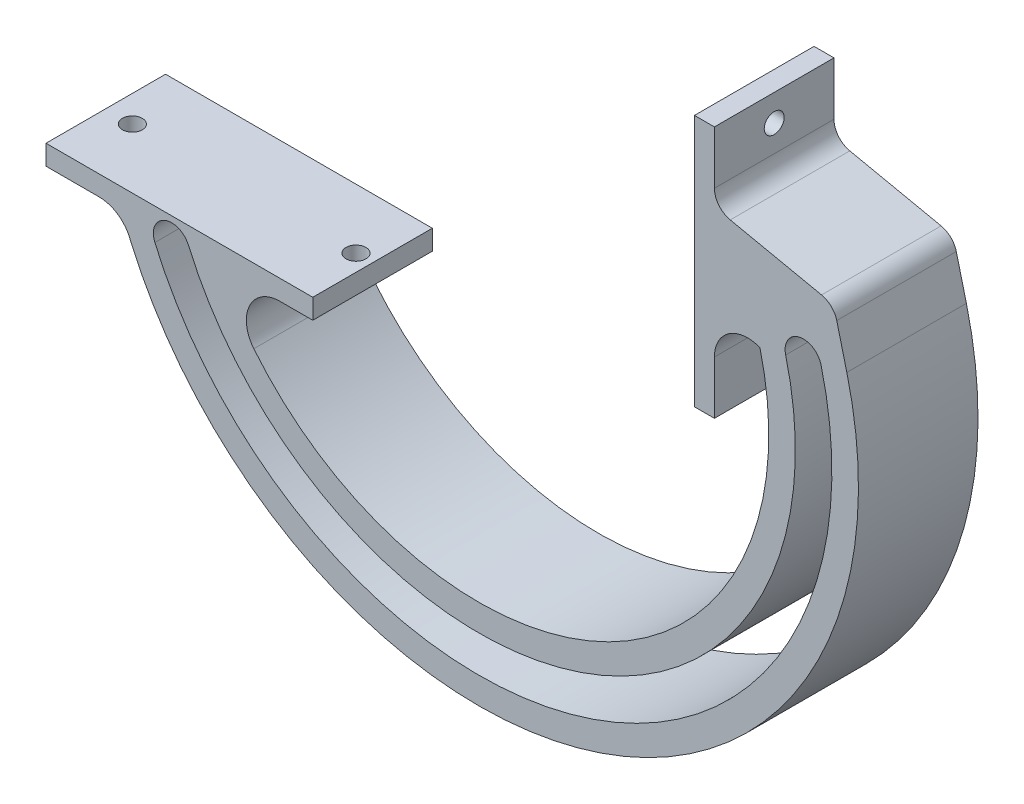
ISO-10303-21;
HEADER;
FILE_DESCRIPTION(('STEP AP214'),'2;1');
FILE_NAME('part.step','',(''),(''),'','','');
FILE_SCHEMA(('AUTOMOTIVE_DESIGN { 1 0 10303 214 1 1 1 1 }'));
ENDSEC;
DATA;
#1=APPLICATION_CONTEXT('core data for automotive mechanical design processes');
#2=APPLICATION_PROTOCOL_DEFINITION('international standard','automotive_design',2000,#1);
#3=PRODUCT_CONTEXT('',#1,'mechanical');
#4=PRODUCT('Part','Part','',(#3));
#5=PRODUCT_RELATED_PRODUCT_CATEGORY('part','',(#4));
#6=PRODUCT_DEFINITION_FORMATION('','',#4);
#7=PRODUCT_DEFINITION_CONTEXT('part definition',#1,'design');
#8=PRODUCT_DEFINITION('design','',#6,#7);
#9=PRODUCT_DEFINITION_SHAPE('','',#8);
#10=(LENGTH_UNIT() NAMED_UNIT(*) SI_UNIT(.MILLI.,.METRE.));
#11=(NAMED_UNIT(*) PLANE_ANGLE_UNIT() SI_UNIT($,.RADIAN.));
#12=(NAMED_UNIT(*) SI_UNIT($,.STERADIAN.) SOLID_ANGLE_UNIT());
#13=UNCERTAINTY_MEASURE_WITH_UNIT(LENGTH_MEASURE(1.E-05),#10,'distance_accuracy_value','');
#14=(GEOMETRIC_REPRESENTATION_CONTEXT(3) GLOBAL_UNCERTAINTY_ASSIGNED_CONTEXT((#13)) GLOBAL_UNIT_ASSIGNED_CONTEXT((#10,
#11,#12)) REPRESENTATION_CONTEXT('',''));
#15=CARTESIAN_POINT('',(0.,0.,0.));
#16=DIRECTION('',(0.,0.,1.));
#17=DIRECTION('',(1.,0.,0.));
#18=AXIS2_PLACEMENT_3D('',#15,#16,#17);
#19=CARTESIAN_POINT('',(21.8963046697023,0.,-9.));
#20=DIRECTION('',(-1.,0.,0.));
#21=DIRECTION('',(0.,-1.,0.));
#22=AXIS2_PLACEMENT_3D('',#19,#20,#21);
#23=PLANE('',#22);
#24=CARTESIAN_POINT('',(21.8963046697023,55.3880299889985,0.));
#25=DIRECTION('',(-1.,0.,0.));
#26=DIRECTION('',(0.,-1.,0.));
#27=AXIS2_PLACEMENT_3D('',#24,#25,#26);
#28=CIRCLE('',#27,1.5);
#29=CARTESIAN_POINT('',(21.8963046697023,56.8880299889985,0.));
#30=VERTEX_POINT('',#29);
#31=EDGE_CURVE('E249',#30,#30,#28,.T.);
#32=ORIENTED_EDGE('',*,*,#31,.T.);
#33=EDGE_LOOP('',(#32));
#34=FACE_BOUND('',#33,.T.);
#35=DIRECTION('',(0.,0.,-1.));
#36=VECTOR('',#35,1.);
#37=CARTESIAN_POINT('',(21.8963046697023,51.3880299889985,9.));
#38=LINE('',#37,#36);
#39=CARTESIAN_POINT('',(21.8963046697023,51.3880299889985,9.));
#40=VERTEX_POINT('',#39);
#41=CARTESIAN_POINT('',(21.8963046697023,51.3880299889985,-9.));
#42=VERTEX_POINT('',#41);
#43=EDGE_CURVE('E273',#40,#42,#38,.T.);
#44=ORIENTED_EDGE('',*,*,#43,.T.);
#45=DIRECTION('',(0.,-1.,0.));
#46=VECTOR('',#45,1.);
#47=CARTESIAN_POINT('',(21.8963046697023,0.,-9.));
#48=LINE('',#47,#46);
#49=CARTESIAN_POINT('',(21.8963046697023,59.3880299889985,-9.));
#50=VERTEX_POINT('',#49);
#51=EDGE_CURVE('E277',#50,#42,#48,.T.);
#52=ORIENTED_EDGE('',*,*,#51,.F.);
#53=DIRECTION('',(0.,0.,-1.));
#54=VECTOR('',#53,1.);
#55=CARTESIAN_POINT('',(21.8963046697023,59.3880299889985,9.));
#56=LINE('',#55,#54);
#57=CARTESIAN_POINT('',(21.8963046697023,59.3880299889985,9.));
#58=VERTEX_POINT('',#57);
#59=EDGE_CURVE('E231',#58,#50,#56,.T.);
#60=ORIENTED_EDGE('',*,*,#59,.F.);
#61=DIRECTION('',(0.,-1.,0.));
#62=VECTOR('',#61,1.);
#63=CARTESIAN_POINT('',(21.8963046697023,0.,9.));
#64=LINE('',#63,#62);
#65=EDGE_CURVE('E222',#58,#40,#64,.T.);
#66=ORIENTED_EDGE('',*,*,#65,.T.);
#67=EDGE_LOOP('',(#44,#52,#60,#66));
#68=FACE_BOUND('',#67,.T.);
#69=ADVANCED_FACE('F45',(#34,#68),#23,.F.);
#70=CARTESIAN_POINT('',(-59.8183992300001,3.28891664000023,9.));
#71=DIRECTION('',(0.,0.,-1.));
#72=DIRECTION('',(-1.,0.,0.));
#73=AXIS2_PLACEMENT_3D('',#70,#71,#72);
#74=CYLINDRICAL_SURFACE('',#73,6.75);
#75=DIRECTION('',(0.,0.,-1.));
#76=VECTOR('',#75,1.);
#77=CARTESIAN_POINT('',(-66.1614947127887,0.980748601007607,9.));
#78=LINE('',#77,#76);
#79=CARTESIAN_POINT('',(-66.1614947127887,0.98074860100761,9.));
#80=VERTEX_POINT('',#79);
#81=CARTESIAN_POINT('',(-66.1614947127887,0.980748601007607,-9.));
#82=VERTEX_POINT('',#81);
#83=EDGE_CURVE('E317',#80,#82,#78,.T.);
#84=ORIENTED_EDGE('',*,*,#83,.T.);
#85=CARTESIAN_POINT('',(-59.8183992300001,3.28891664000023,-9.));
#86=DIRECTION('',(0.,0.,1.));
#87=DIRECTION('',(1.,0.,0.));
#88=AXIS2_PLACEMENT_3D('',#85,#86,#87);
#89=CIRCLE('',#88,6.75);
#90=CARTESIAN_POINT('',(-66.0126184035577,0.606725589770724,-9.));
#91=VERTEX_POINT('',#90);
#92=EDGE_CURVE('E358',#82,#91,#89,.T.);
#93=ORIENTED_EDGE('',*,*,#92,.T.);
#94=DIRECTION('',(0.,0.,-1.));
#95=VECTOR('',#94,1.);
#96=CARTESIAN_POINT('',(-66.0126184035577,0.606725589770724,9.));
#97=LINE('',#96,#95);
#98=CARTESIAN_POINT('',(-66.0126184035577,0.606725589770724,9.));
#99=VERTEX_POINT('',#98);
#100=EDGE_CURVE('E390',#99,#91,#97,.T.);
#101=ORIENTED_EDGE('',*,*,#100,.F.);
#102=CARTESIAN_POINT('',(-59.8183992300001,3.28891664000023,9.));
#103=DIRECTION('',(0.,0.,1.));
#104=DIRECTION('',(1.,0.,0.));
#105=AXIS2_PLACEMENT_3D('',#102,#103,#104);
#106=CIRCLE('',#105,6.75);
#107=EDGE_CURVE('E62',#80,#99,#106,.T.);
#108=ORIENTED_EDGE('',*,*,#107,.F.);
#109=EDGE_LOOP('',(#84,#93,#101,#108));
#110=FACE_BOUND('',#109,.T.);
#111=ADVANCED_FACE('F441',(#110),#74,.T.);
#112=CARTESIAN_POINT('',(-13.5682293422799,23.3159431737053,9.));
#113=DIRECTION('',(0.,0.,-1.));
#114=DIRECTION('',(-1.,0.,0.));
#115=AXIS2_PLACEMENT_3D('',#112,#113,#114);
#116=CYLINDRICAL_SURFACE('',#115,57.1500000637372);
#117=CARTESIAN_POINT('',(-13.5682293422799,23.3159431737053,-9.));
#118=DIRECTION('',(0.,0.,1.));
#119=DIRECTION('',(1.,0.,0.));
#120=AXIS2_PLACEMENT_3D('',#117,#118,#119);
#121=CIRCLE('',#120,57.1500000637372);
#122=CARTESIAN_POINT('',(41.8322994444411,37.3481888042828,-9.));
#123=VERTEX_POINT('',#122);
#124=EDGE_CURVE('E384',#91,#123,#121,.T.);
#125=ORIENTED_EDGE('',*,*,#124,.T.);
#126=DIRECTION('',(0.,0.,-1.));
#127=VECTOR('',#126,1.);
#128=CARTESIAN_POINT('',(41.8322994444411,37.3481888042828,9.));
#129=LINE('',#128,#127);
#130=CARTESIAN_POINT('',(41.8322994444411,37.3481888042828,9.));
#131=VERTEX_POINT('',#130);
#132=EDGE_CURVE('E11',#131,#123,#129,.T.);
#133=ORIENTED_EDGE('',*,*,#132,.F.);
#134=CARTESIAN_POINT('',(-13.5682293422799,23.3159431737053,9.));
#135=DIRECTION('',(0.,0.,1.));
#136=DIRECTION('',(1.,0.,0.));
#137=AXIS2_PLACEMENT_3D('',#134,#135,#136);
#138=CIRCLE('',#137,57.1500000637372);
#139=EDGE_CURVE('E366',#99,#131,#138,.T.);
#140=ORIENTED_EDGE('',*,*,#139,.F.);
#141=ORIENTED_EDGE('',*,*,#100,.T.);
#142=EDGE_LOOP('',(#125,#133,#140,#141));
#143=FACE_BOUND('',#142,.T.);
#144=ADVANCED_FACE('F449',(#143),#116,.T.);
#145=CARTESIAN_POINT('',(-13.5682293422799,23.3159431737053,9.));
#146=DIRECTION('',(0.,0.,-1.));
#147=DIRECTION('',(-1.,0.,0.));
#148=AXIS2_PLACEMENT_3D('',#145,#146,#147);
#149=CYLINDRICAL_SURFACE('',#148,43.6500000637372);
#150=DIRECTION('',(0.,0.,-1.));
#151=VECTOR('',#150,1.);
#152=CARTESIAN_POINT('',(-47.4479859261599,-4.20649493379697,9.));
#153=LINE('',#152,#151);
#154=CARTESIAN_POINT('',(-47.4479859261599,-4.20649493379697,9.));
#155=VERTEX_POINT('',#154);
#156=CARTESIAN_POINT('',(-47.4479859261599,-4.20649493379697,-9.));
#157=VERTEX_POINT('',#156);
#158=EDGE_CURVE('E338',#155,#157,#153,.T.);
#159=ORIENTED_EDGE('',*,*,#158,.F.);
#160=CARTESIAN_POINT('',(-13.5682293422799,23.3159431737053,9.));
#161=DIRECTION('',(0.,0.,1.));
#162=DIRECTION('',(1.,0.,0.));
#163=AXIS2_PLACEMENT_3D('',#160,#161,#162);
#164=CIRCLE('',#163,43.6500000637372);
#165=CARTESIAN_POINT('',(28.7455603755589,34.0334851157172,9.));
#166=VERTEX_POINT('',#165);
#167=EDGE_CURVE('E369',#155,#166,#164,.T.);
#168=ORIENTED_EDGE('',*,*,#167,.T.);
#169=DIRECTION('',(0.,0.,-1.));
#170=VECTOR('',#169,1.);
#171=CARTESIAN_POINT('',(28.7455603755589,34.0334851157172,9.));
#172=LINE('',#171,#170);
#173=CARTESIAN_POINT('',(28.7455603755589,34.0334851157172,-9.));
#174=VERTEX_POINT('',#173);
#175=EDGE_CURVE('E54',#166,#174,#172,.T.);
#176=ORIENTED_EDGE('',*,*,#175,.T.);
#177=CARTESIAN_POINT('',(-13.5682293422799,23.3159431737053,-9.));
#178=DIRECTION('',(0.,0.,1.));
#179=DIRECTION('',(1.,0.,0.));
#180=AXIS2_PLACEMENT_3D('',#177,#178,#179);
#181=CIRCLE('',#180,43.6500000637372);
#182=EDGE_CURVE('E387',#157,#174,#181,.T.);
#183=ORIENTED_EDGE('',*,*,#182,.F.);
#184=EDGE_LOOP('',(#159,#168,#176,#183));
#185=FACE_BOUND('',#184,.T.);
#186=ADVANCED_FACE('F487',(#185),#149,.F.);
#187=CARTESIAN_POINT('',(35.28892991,35.69083696,9.));
#188=DIRECTION('',(0.,0.,-1.));
#189=DIRECTION('',(-1.,0.,0.));
#190=AXIS2_PLACEMENT_3D('',#187,#188,#189);
#191=CYLINDRICAL_SURFACE('',#190,2.75000000000001);
#192=CARTESIAN_POINT('',(35.28892991,35.69083696,-9.));
#193=DIRECTION('',(0.,0.,1.));
#194=DIRECTION('',(1.,0.,0.));
#195=AXIS2_PLACEMENT_3D('',#192,#193,#194);
#196=CIRCLE('',#195,2.75000000000001);
#197=CARTESIAN_POINT('',(37.9547471277353,36.3660543780412,-9.));
#198=VERTEX_POINT('',#197);
#199=CARTESIAN_POINT('',(32.6231126922647,35.0156195419588,-9.));
#200=VERTEX_POINT('',#199);
#201=EDGE_CURVE('E348',#198,#200,#196,.T.);
#202=ORIENTED_EDGE('',*,*,#201,.F.);
#203=DIRECTION('',(0.,0.,-1.));
#204=VECTOR('',#203,1.);
#205=CARTESIAN_POINT('',(37.9547471277353,36.3660543780412,9.));
#206=LINE('',#205,#204);
#207=CARTESIAN_POINT('',(37.9547471277353,36.3660543780412,9.));
#208=VERTEX_POINT('',#207);
#209=EDGE_CURVE('E393',#208,#198,#206,.T.);
#210=ORIENTED_EDGE('',*,*,#209,.F.);
#211=CARTESIAN_POINT('',(35.28892991,35.69083696,9.));
#212=DIRECTION('',(0.,0.,1.));
#213=DIRECTION('',(1.,0.,0.));
#214=AXIS2_PLACEMENT_3D('',#211,#212,#213);
#215=CIRCLE('',#214,2.75000000000001);
#216=CARTESIAN_POINT('',(32.6231126922647,35.0156195419588,9.));
#217=VERTEX_POINT('',#216);
#218=EDGE_CURVE('E354',#208,#217,#215,.T.);
#219=ORIENTED_EDGE('',*,*,#218,.T.);
#220=DIRECTION('',(0.,0.,-1.));
#221=VECTOR('',#220,1.);
#222=CARTESIAN_POINT('',(32.6231126922647,35.0156195419588,9.));
#223=LINE('',#222,#221);
#224=EDGE_CURVE('E372',#217,#200,#223,.T.);
#225=ORIENTED_EDGE('',*,*,#224,.T.);
#226=EDGE_LOOP('',(#202,#210,#219,#225));
#227=FACE_BOUND('',#226,.T.);
#228=ADVANCED_FACE('F47',(#227),#191,.F.);
#229=CARTESIAN_POINT('',(-13.5682293422799,23.3159431737054,9.));
#230=DIRECTION('',(0.,0.,-1.));
#231=DIRECTION('',(-1.,0.,0.));
#232=AXIS2_PLACEMENT_3D('',#229,#230,#231);
#233=CYLINDRICAL_SURFACE('',#232,53.1500000637372);
#234=CARTESIAN_POINT('',(-13.5682293422799,23.3159431737054,-9.));
#235=DIRECTION('',(0.,0.,1.));
#236=DIRECTION('',(1.,0.,0.));
#237=AXIS2_PLACEMENT_3D('',#234,#235,#236);
#238=CIRCLE('',#237,53.1500000637372);
#239=CARTESIAN_POINT('',(-62.3419700044124,2.19617213805475,-9.));
#240=VERTEX_POINT('',#239);
#241=EDGE_CURVE('E375',#240,#198,#238,.T.);
#242=ORIENTED_EDGE('',*,*,#241,.F.);
#243=DIRECTION('',(0.,0.,-1.));
#244=VECTOR('',#243,1.);
#245=CARTESIAN_POINT('',(-62.3419700044124,2.19617213805475,9.));
#246=LINE('',#245,#244);
#247=CARTESIAN_POINT('',(-62.3419700044124,2.19617213805475,9.));
#248=VERTEX_POINT('',#247);
#249=EDGE_CURVE('E398',#248,#240,#246,.T.);
#250=ORIENTED_EDGE('',*,*,#249,.F.);
#251=CARTESIAN_POINT('',(-13.5682293422799,23.3159431737054,9.));
#252=DIRECTION('',(0.,0.,1.));
#253=DIRECTION('',(1.,0.,0.));
#254=AXIS2_PLACEMENT_3D('',#251,#252,#253);
#255=CIRCLE('',#254,53.1500000637372);
#256=EDGE_CURVE('E357',#248,#208,#255,.T.);
#257=ORIENTED_EDGE('',*,*,#256,.T.);
#258=ORIENTED_EDGE('',*,*,#209,.T.);
#259=EDGE_LOOP('',(#242,#250,#257,#258));
#260=FACE_BOUND('',#259,.T.);
#261=ADVANCED_FACE('F499',(#260),#233,.F.);
#262=CARTESIAN_POINT('',(-59.81839923,3.28891664,9.));
#263=DIRECTION('',(0.,0.,-1.));
#264=DIRECTION('',(-1.,0.,0.));
#265=AXIS2_PLACEMENT_3D('',#262,#263,#264);
#266=CYLINDRICAL_SURFACE('',#265,2.75);
#267=CARTESIAN_POINT('',(-59.81839923,3.28891664,-9.));
#268=DIRECTION('',(0.,0.,1.));
#269=DIRECTION('',(1.,0.,0.));
#270=AXIS2_PLACEMENT_3D('',#267,#268,#269);
#271=CIRCLE('',#270,2.75);
#272=CARTESIAN_POINT('',(-57.2948284555876,4.38166114194528,-9.));
#273=VERTEX_POINT('',#272);
#274=EDGE_CURVE('E378',#273,#240,#271,.T.);
#275=ORIENTED_EDGE('',*,*,#274,.F.);
#276=DIRECTION('',(0.,0.,-1.));
#277=VECTOR('',#276,1.);
#278=CARTESIAN_POINT('',(-57.2948284555876,4.38166114194528,9.));
#279=LINE('',#278,#277);
#280=CARTESIAN_POINT('',(-57.2948284555876,4.38166114194528,9.));
#281=VERTEX_POINT('',#280);
#282=EDGE_CURVE('E396',#281,#273,#279,.T.);
#283=ORIENTED_EDGE('',*,*,#282,.F.);
#284=CARTESIAN_POINT('',(-59.81839923,3.28891664,9.));
#285=DIRECTION('',(0.,0.,1.));
#286=DIRECTION('',(1.,0.,0.));
#287=AXIS2_PLACEMENT_3D('',#284,#285,#286);
#288=CIRCLE('',#287,2.75);
#289=EDGE_CURVE('E361',#281,#248,#288,.T.);
#290=ORIENTED_EDGE('',*,*,#289,.T.);
#291=ORIENTED_EDGE('',*,*,#249,.T.);
#292=EDGE_LOOP('',(#275,#283,#290,#291));
#293=FACE_BOUND('',#292,.T.);
#294=ADVANCED_FACE('F496',(#293),#266,.F.);
#295=CARTESIAN_POINT('',(-13.5682293422799,23.3159431737054,9.));
#296=DIRECTION('',(0.,0.,-1.));
#297=DIRECTION('',(-1.,0.,0.));
#298=AXIS2_PLACEMENT_3D('',#295,#296,#297);
#299=CYLINDRICAL_SURFACE('',#298,47.6500000637372);
#300=CARTESIAN_POINT('',(-13.5682293422799,23.3159431737054,-9.));
#301=DIRECTION('',(0.,0.,1.));
#302=DIRECTION('',(1.,0.,0.));
#303=AXIS2_PLACEMENT_3D('',#300,#301,#302);
#304=CIRCLE('',#303,47.6500000637372);
#305=EDGE_CURVE('E381',#273,#200,#304,.T.);
#306=ORIENTED_EDGE('',*,*,#305,.T.);
#307=ORIENTED_EDGE('',*,*,#224,.F.);
#308=CARTESIAN_POINT('',(-13.5682293422799,23.3159431737054,9.));
#309=DIRECTION('',(0.,0.,1.));
#310=DIRECTION('',(1.,0.,0.));
#311=AXIS2_PLACEMENT_3D('',#308,#309,#310);
#312=CIRCLE('',#311,47.6500000637372);
#313=EDGE_CURVE('E364',#281,#217,#312,.T.);
#314=ORIENTED_EDGE('',*,*,#313,.F.);
#315=ORIENTED_EDGE('',*,*,#282,.T.);
#316=EDGE_LOOP('',(#306,#307,#314,#315));
#317=FACE_BOUND('',#316,.T.);
#318=ADVANCED_FACE('F484',(#317),#299,.T.);
#319=CARTESIAN_POINT('',(0.,0.,9.));
#320=DIRECTION('',(0.,0.,1.));
#321=DIRECTION('',(1.,0.,0.));
#322=AXIS2_PLACEMENT_3D('',#319,#320,#321);
#323=PLANE('',#322);
#324=DIRECTION('',(-1.,0.,0.));
#325=VECTOR('',#324,1.);
#326=CARTESIAN_POINT('',(0.,6.94613256532267,9.));
#327=LINE('',#326,#325);
#328=CARTESIAN_POINT('',(-38.5671432532608,6.94613256532267,9.));
#329=VERTEX_POINT('',#328);
#330=CARTESIAN_POINT('',(-78.7288065685013,6.94613256532267,9.));
#331=VERTEX_POINT('',#330);
#332=EDGE_CURVE('E329',#329,#331,#327,.T.);
#333=ORIENTED_EDGE('',*,*,#332,.T.);
#334=DIRECTION('',(0.,-1.,0.));
#335=VECTOR('',#334,1.);
#336=CARTESIAN_POINT('',(-78.7288065685013,0.,9.));
#337=LINE('',#336,#335);
#338=CARTESIAN_POINT('',(-78.7288065685013,3.94613256532267,9.));
#339=VERTEX_POINT('',#338);
#340=EDGE_CURVE('E309',#331,#339,#337,.T.);
#341=ORIENTED_EDGE('',*,*,#340,.T.);
#342=DIRECTION('',(1.,0.,0.));
#343=VECTOR('',#342,1.);
#344=CARTESIAN_POINT('',(0.,3.94613256532265,9.));
#345=LINE('',#344,#343);
#346=CARTESIAN_POINT('',(-70.7288065685014,3.94613256532267,9.));
#347=VERTEX_POINT('',#346);
#348=EDGE_CURVE('E306',#339,#347,#345,.T.);
#349=ORIENTED_EDGE('',*,*,#348,.T.);
#350=CARTESIAN_POINT('',(-70.7288065685014,-1.05386743467733,9.));
#351=DIRECTION('',(0.,0.,-1.));
#352=DIRECTION('',(-1.,0.,0.));
#353=AXIS2_PLACEMENT_3D('',#350,#351,#352);
#354=CIRCLE('',#353,5.);
#355=EDGE_CURVE('E304',#347,#80,#354,.T.);
#356=ORIENTED_EDGE('',*,*,#355,.T.);
#357=ORIENTED_EDGE('',*,*,#107,.T.);
#358=ORIENTED_EDGE('',*,*,#139,.T.);
#359=DIRECTION('',(0.245533606560409,-0.969388079176466,0.));
#360=VECTOR('',#359,1.);
#361=CARTESIAN_POINT('',(41.8322994444411,37.3481888042828,9.));
#362=LINE('',#361,#360);
#363=CARTESIAN_POINT('',(40.3125761561024,43.3481888042828,9.));
#364=VERTEX_POINT('',#363);
#365=EDGE_CURVE('E232',#364,#131,#362,.T.);
#366=ORIENTED_EDGE('',*,*,#365,.F.);
#367=CARTESIAN_POINT('',(37.404411918573,42.6115879846016,9.));
#368=DIRECTION('',(0.,0.,-1.));
#369=DIRECTION('',(-1.,0.,0.));
#370=AXIS2_PLACEMENT_3D('',#367,#368,#369);
#371=CIRCLE('',#370,3.00000000000001);
#372=CARTESIAN_POINT('',(38.0248217699052,45.5467356157047,9.));
#373=VERTEX_POINT('',#372);
#374=EDGE_CURVE('E254',#373,#364,#371,.T.);
#375=ORIENTED_EDGE('',*,*,#374,.F.);
#376=DIRECTION('',(0.978382543701023,-0.206803283777402,0.));
#377=VECTOR('',#376,1.);
#378=CARTESIAN_POINT('',(38.0248217699052,45.5467356157047,9.));
#379=LINE('',#378,#377);
#380=CARTESIAN_POINT('',(24.2758948183701,48.4528823578955,9.));
#381=VERTEX_POINT('',#380);
#382=EDGE_CURVE('E243',#381,#373,#379,.T.);
#383=ORIENTED_EDGE('',*,*,#382,.F.);
#384=CARTESIAN_POINT('',(24.8963046697023,51.3880299889985,9.));
#385=DIRECTION('',(0.,0.,1.));
#386=DIRECTION('',(1.,0.,0.));
#387=AXIS2_PLACEMENT_3D('',#384,#385,#386);
#388=CIRCLE('',#387,3.);
#389=EDGE_CURVE('E239',#40,#381,#388,.T.);
#390=ORIENTED_EDGE('',*,*,#389,.F.);
#391=ORIENTED_EDGE('',*,*,#65,.F.);
#392=DIRECTION('',(1.,0.,0.));
#393=VECTOR('',#392,1.);
#394=CARTESIAN_POINT('',(21.8963046697023,59.3880299889985,9.));
#395=LINE('',#394,#393);
#396=CARTESIAN_POINT('',(18.8963046697023,59.3880299889985,9.));
#397=VERTEX_POINT('',#396);
#398=EDGE_CURVE('E228',#397,#58,#395,.T.);
#399=ORIENTED_EDGE('',*,*,#398,.F.);
#400=DIRECTION('',(0.,1.,0.));
#401=VECTOR('',#400,1.);
#402=CARTESIAN_POINT('',(18.8963046697023,0.,9.));
#403=LINE('',#402,#401);
#404=CARTESIAN_POINT('',(18.8963046697023,21.3880299889985,9.));
#405=VERTEX_POINT('',#404);
#406=EDGE_CURVE('E210',#405,#397,#403,.T.);
#407=ORIENTED_EDGE('',*,*,#406,.F.);
#408=DIRECTION('',(1.,0.,0.));
#409=VECTOR('',#408,1.);
#410=CARTESIAN_POINT('',(0.,21.3880299889985,9.));
#411=LINE('',#410,#409);
#412=CARTESIAN_POINT('',(21.8963046697023,21.3880299889985,9.));
#413=VERTEX_POINT('',#412);
#414=EDGE_CURVE('E221',#405,#413,#411,.T.);
#415=ORIENTED_EDGE('',*,*,#414,.T.);
#416=DIRECTION('',(0.,1.,0.));
#417=VECTOR('',#416,1.);
#418=CARTESIAN_POINT('',(21.8963046697023,0.,9.));
#419=LINE('',#418,#417);
#420=CARTESIAN_POINT('',(21.8963046697023,29.3880299889985,9.));
#421=VERTEX_POINT('',#420);
#422=EDGE_CURVE('E293',#413,#421,#419,.T.);
#423=ORIENTED_EDGE('',*,*,#422,.T.);
#424=CARTESIAN_POINT('',(26.8963046697023,29.3880299889985,9.));
#425=DIRECTION('',(0.,0.,1.));
#426=DIRECTION('',(1.,0.,0.));
#427=AXIS2_PLACEMENT_3D('',#424,#425,#426);
#428=CIRCLE('',#427,5.);
#429=EDGE_CURVE('E281',#166,#421,#428,.T.);
#430=ORIENTED_EDGE('',*,*,#429,.F.);
#431=ORIENTED_EDGE('',*,*,#167,.F.);
#432=CARTESIAN_POINT('',(-43.5671432532608,-1.05386743467733,9.));
#433=DIRECTION('',(0.,0.,-1.));
#434=DIRECTION('',(-1.,0.,0.));
#435=AXIS2_PLACEMENT_3D('',#432,#433,#434);
#436=CIRCLE('',#435,5.);
#437=CARTESIAN_POINT('',(-43.5671432532608,3.94613256532267,9.));
#438=VERTEX_POINT('',#437);
#439=EDGE_CURVE('E327',#155,#438,#436,.T.);
#440=ORIENTED_EDGE('',*,*,#439,.T.);
#441=DIRECTION('',(-1.,0.,0.));
#442=VECTOR('',#441,1.);
#443=CARTESIAN_POINT('',(0.,3.94613256532267,9.));
#444=LINE('',#443,#442);
#445=CARTESIAN_POINT('',(-38.5671432532608,3.94613256532267,9.));
#446=VERTEX_POINT('',#445);
#447=EDGE_CURVE('E335',#446,#438,#444,.T.);
#448=ORIENTED_EDGE('',*,*,#447,.F.);
#449=DIRECTION('',(0.,-1.,0.));
#450=VECTOR('',#449,1.);
#451=CARTESIAN_POINT('',(-38.5671432532608,0.,9.));
#452=LINE('',#451,#450);
#453=EDGE_CURVE('E332',#329,#446,#452,.T.);
#454=ORIENTED_EDGE('',*,*,#453,.F.);
#455=EDGE_LOOP('',(#333,#341,#349,#356,#357,#358,#366,#375,#383,#390,#391,#399,#407,#415,#423,
#430,#431,#440,#448,#454));
#456=FACE_BOUND('',#455,.T.);
#457=ORIENTED_EDGE('',*,*,#218,.F.);
#458=ORIENTED_EDGE('',*,*,#256,.F.);
#459=ORIENTED_EDGE('',*,*,#289,.F.);
#460=ORIENTED_EDGE('',*,*,#313,.T.);
#461=EDGE_LOOP('',(#457,#458,#459,#460));
#462=FACE_BOUND('',#461,.T.);
#463=ADVANCED_FACE('F234',(#456,#462),#323,.T.);
#464=CARTESIAN_POINT('',(0.,0.,-9.));
#465=DIRECTION('',(0.,0.,1.));
#466=DIRECTION('',(1.,0.,0.));
#467=AXIS2_PLACEMENT_3D('',#464,#465,#466);
#468=PLANE('',#467);
#469=DIRECTION('',(0.,-1.,0.));
#470=VECTOR('',#469,1.);
#471=CARTESIAN_POINT('',(-78.7288065685013,0.,-9.));
#472=LINE('',#471,#470);
#473=CARTESIAN_POINT('',(-78.7288065685013,6.94613256532267,-9.));
#474=VERTEX_POINT('',#473);
#475=CARTESIAN_POINT('',(-78.7288065685013,3.94613256532267,-9.));
#476=VERTEX_POINT('',#475);
#477=EDGE_CURVE('E307',#474,#476,#472,.T.);
#478=ORIENTED_EDGE('',*,*,#477,.F.);
#479=DIRECTION('',(-1.,0.,0.));
#480=VECTOR('',#479,1.);
#481=CARTESIAN_POINT('',(0.,6.94613256532267,-9.));
#482=LINE('',#481,#480);
#483=CARTESIAN_POINT('',(-38.5671432532608,6.94613256532267,-9.));
#484=VERTEX_POINT('',#483);
#485=EDGE_CURVE('E340',#484,#474,#482,.T.);
#486=ORIENTED_EDGE('',*,*,#485,.F.);
#487=DIRECTION('',(0.,-1.,0.));
#488=VECTOR('',#487,1.);
#489=CARTESIAN_POINT('',(-38.5671432532608,0.,-9.));
#490=LINE('',#489,#488);
#491=CARTESIAN_POINT('',(-38.5671432532608,3.94613256532267,-9.));
#492=VERTEX_POINT('',#491);
#493=EDGE_CURVE('E342',#484,#492,#490,.T.);
#494=ORIENTED_EDGE('',*,*,#493,.T.);
#495=DIRECTION('',(-1.,0.,0.));
#496=VECTOR('',#495,1.);
#497=CARTESIAN_POINT('',(0.,3.94613256532267,-9.));
#498=LINE('',#497,#496);
#499=CARTESIAN_POINT('',(-43.5671432532608,3.94613256532267,-9.));
#500=VERTEX_POINT('',#499);
#501=EDGE_CURVE('E330',#492,#500,#498,.T.);
#502=ORIENTED_EDGE('',*,*,#501,.T.);
#503=CARTESIAN_POINT('',(-43.5671432532608,-1.05386743467733,-9.));
#504=DIRECTION('',(0.,0.,-1.));
#505=DIRECTION('',(-1.,0.,0.));
#506=AXIS2_PLACEMENT_3D('',#503,#504,#505);
#507=CIRCLE('',#506,5.);
#508=EDGE_CURVE('E70',#157,#500,#507,.T.);
#509=ORIENTED_EDGE('',*,*,#508,.F.);
#510=ORIENTED_EDGE('',*,*,#182,.T.);
#511=CARTESIAN_POINT('',(26.8963046697023,29.3880299889985,-9.));
#512=DIRECTION('',(0.,0.,1.));
#513=DIRECTION('',(1.,0.,0.));
#514=AXIS2_PLACEMENT_3D('',#511,#512,#513);
#515=CIRCLE('',#514,5.);
#516=CARTESIAN_POINT('',(21.8963046697023,29.3880299889985,-9.));
#517=VERTEX_POINT('',#516);
#518=EDGE_CURVE('E289',#174,#517,#515,.T.);
#519=ORIENTED_EDGE('',*,*,#518,.T.);
#520=DIRECTION('',(0.,1.,0.));
#521=VECTOR('',#520,1.);
#522=CARTESIAN_POINT('',(21.8963046697023,0.,-9.));
#523=LINE('',#522,#521);
#524=CARTESIAN_POINT('',(21.8963046697023,21.3880299889985,-9.));
#525=VERTEX_POINT('',#524);
#526=EDGE_CURVE('E286',#525,#517,#523,.T.);
#527=ORIENTED_EDGE('',*,*,#526,.F.);
#528=DIRECTION('',(1.,0.,0.));
#529=VECTOR('',#528,1.);
#530=CARTESIAN_POINT('',(0.,21.3880299889985,-9.));
#531=LINE('',#530,#529);
#532=CARTESIAN_POINT('',(18.8963046697023,21.3880299889985,-9.));
#533=VERTEX_POINT('',#532);
#534=EDGE_CURVE('E283',#533,#525,#531,.T.);
#535=ORIENTED_EDGE('',*,*,#534,.F.);
#536=DIRECTION('',(0.,1.,0.));
#537=VECTOR('',#536,1.);
#538=CARTESIAN_POINT('',(18.8963046697023,0.,-9.));
#539=LINE('',#538,#537);
#540=CARTESIAN_POINT('',(18.8963046697023,59.3880299889985,-9.));
#541=VERTEX_POINT('',#540);
#542=EDGE_CURVE('E280',#533,#541,#539,.T.);
#543=ORIENTED_EDGE('',*,*,#542,.T.);
#544=DIRECTION('',(1.,0.,0.));
#545=VECTOR('',#544,1.);
#546=CARTESIAN_POINT('',(21.8963046697023,59.3880299889985,-9.));
#547=LINE('',#546,#545);
#548=EDGE_CURVE('E230',#541,#50,#547,.T.);
#549=ORIENTED_EDGE('',*,*,#548,.T.);
#550=ORIENTED_EDGE('',*,*,#51,.T.);
#551=CARTESIAN_POINT('',(24.8963046697023,51.3880299889985,-9.));
#552=DIRECTION('',(0.,0.,1.));
#553=DIRECTION('',(1.,0.,0.));
#554=AXIS2_PLACEMENT_3D('',#551,#552,#553);
#555=CIRCLE('',#554,3.);
#556=CARTESIAN_POINT('',(24.2758948183701,48.4528823578955,-9.));
#557=VERTEX_POINT('',#556);
#558=EDGE_CURVE('E259',#42,#557,#555,.T.);
#559=ORIENTED_EDGE('',*,*,#558,.T.);
#560=DIRECTION('',(0.978382543701023,-0.206803283777402,0.));
#561=VECTOR('',#560,1.);
#562=CARTESIAN_POINT('',(38.0248217699052,45.5467356157047,-9.));
#563=LINE('',#562,#561);
#564=CARTESIAN_POINT('',(38.0248217699052,45.5467356157047,-9.));
#565=VERTEX_POINT('',#564);
#566=EDGE_CURVE('E262',#557,#565,#563,.T.);
#567=ORIENTED_EDGE('',*,*,#566,.T.);
#568=CARTESIAN_POINT('',(37.404411918573,42.6115879846016,-9.));
#569=DIRECTION('',(0.,0.,-1.));
#570=DIRECTION('',(-1.,0.,0.));
#571=AXIS2_PLACEMENT_3D('',#568,#569,#570);
#572=CIRCLE('',#571,3.00000000000001);
#573=CARTESIAN_POINT('',(40.3125761561024,43.3481888042828,-9.));
#574=VERTEX_POINT('',#573);
#575=EDGE_CURVE('E246',#565,#574,#572,.T.);
#576=ORIENTED_EDGE('',*,*,#575,.T.);
#577=DIRECTION('',(0.245533606560409,-0.969388079176466,0.));
#578=VECTOR('',#577,1.);
#579=CARTESIAN_POINT('',(41.8322994444411,37.3481888042828,-9.));
#580=LINE('',#579,#578);
#581=EDGE_CURVE('E240',#574,#123,#580,.T.);
#582=ORIENTED_EDGE('',*,*,#581,.T.);
#583=ORIENTED_EDGE('',*,*,#124,.F.);
#584=ORIENTED_EDGE('',*,*,#92,.F.);
#585=CARTESIAN_POINT('',(-70.7288065685014,-1.05386743467733,-9.));
#586=DIRECTION('',(0.,0.,-1.));
#587=DIRECTION('',(-1.,0.,0.));
#588=AXIS2_PLACEMENT_3D('',#585,#586,#587);
#589=CIRCLE('',#588,5.);
#590=CARTESIAN_POINT('',(-70.7288065685014,3.94613256532267,-9.));
#591=VERTEX_POINT('',#590);
#592=EDGE_CURVE('E300',#591,#82,#589,.T.);
#593=ORIENTED_EDGE('',*,*,#592,.F.);
#594=DIRECTION('',(1.,0.,0.));
#595=VECTOR('',#594,1.);
#596=CARTESIAN_POINT('',(0.,3.94613256532265,-9.));
#597=LINE('',#596,#595);
#598=EDGE_CURVE('E314',#476,#591,#597,.T.);
#599=ORIENTED_EDGE('',*,*,#598,.F.);
#600=EDGE_LOOP('',(#478,#486,#494,#502,#509,#510,#519,#527,#535,#543,#549,#550,#559,#567,#576,
#582,#583,#584,#593,#599));
#601=FACE_BOUND('',#600,.T.);
#602=ORIENTED_EDGE('',*,*,#241,.T.);
#603=ORIENTED_EDGE('',*,*,#201,.T.);
#604=ORIENTED_EDGE('',*,*,#305,.F.);
#605=ORIENTED_EDGE('',*,*,#274,.T.);
#606=EDGE_LOOP('',(#602,#603,#604,#605));
#607=FACE_BOUND('',#606,.T.);
#608=ADVANCED_FACE('F481',(#601,#607),#468,.F.);
#609=CARTESIAN_POINT('',(-43.5671432532608,-1.05386743467733,9.));
#610=DIRECTION('',(0.,0.,-1.));
#611=DIRECTION('',(-1.,0.,0.));
#612=AXIS2_PLACEMENT_3D('',#609,#610,#611);
#613=CYLINDRICAL_SURFACE('',#612,5.);
#614=ORIENTED_EDGE('',*,*,#508,.T.);
#615=DIRECTION('',(0.,0.,-1.));
#616=VECTOR('',#615,1.);
#617=CARTESIAN_POINT('',(-43.5671432532608,3.94613256532267,9.));
#618=LINE('',#617,#616);
#619=EDGE_CURVE('E346',#438,#500,#618,.T.);
#620=ORIENTED_EDGE('',*,*,#619,.F.);
#621=ORIENTED_EDGE('',*,*,#439,.F.);
#622=ORIENTED_EDGE('',*,*,#158,.T.);
#623=EDGE_LOOP('',(#614,#620,#621,#622));
#624=FACE_BOUND('',#623,.T.);
#625=ADVANCED_FACE('F472',(#624),#613,.F.);
#626=CARTESIAN_POINT('',(0.,3.94613256532267,9.));
#627=DIRECTION('',(0.,-1.,0.));
#628=DIRECTION('',(0.,0.,-1.));
#629=AXIS2_PLACEMENT_3D('',#626,#627,#628);
#630=PLANE('',#629);
#631=CARTESIAN_POINT('',(-41.0671432532608,3.94613256532267,0.));
#632=DIRECTION('',(0.,-1.,0.));
#633=DIRECTION('',(0.,0.,-1.));
#634=AXIS2_PLACEMENT_3D('',#631,#632,#633);
#635=CIRCLE('',#634,1.5);
#636=CARTESIAN_POINT('',(-41.0671432532608,3.94613256532267,-1.5));
#637=VERTEX_POINT('',#636);
#638=EDGE_CURVE('E418',#637,#637,#635,.T.);
#639=ORIENTED_EDGE('',*,*,#638,.F.);
#640=EDGE_LOOP('',(#639));
#641=FACE_BOUND('',#640,.T.);
#642=ORIENTED_EDGE('',*,*,#501,.F.);
#643=DIRECTION('',(0.,0.,-1.));
#644=VECTOR('',#643,1.);
#645=CARTESIAN_POINT('',(-38.5671432532608,3.94613256532267,9.));
#646=LINE('',#645,#644);
#647=EDGE_CURVE('E349',#446,#492,#646,.T.);
#648=ORIENTED_EDGE('',*,*,#647,.F.);
#649=ORIENTED_EDGE('',*,*,#447,.T.);
#650=ORIENTED_EDGE('',*,*,#619,.T.);
#651=EDGE_LOOP('',(#642,#648,#649,#650));
#652=FACE_BOUND('',#651,.T.);
#653=ADVANCED_FACE('F469',(#641,#652),#630,.T.);
#654=CARTESIAN_POINT('',(-38.5671432532608,0.,9.));
#655=DIRECTION('',(1.,0.,0.));
#656=DIRECTION('',(0.,0.,-1.));
#657=AXIS2_PLACEMENT_3D('',#654,#655,#656);
#658=PLANE('',#657);
#659=ORIENTED_EDGE('',*,*,#493,.F.);
#660=DIRECTION('',(0.,0.,-1.));
#661=VECTOR('',#660,1.);
#662=CARTESIAN_POINT('',(-38.5671432532608,6.94613256532267,9.));
#663=LINE('',#662,#661);
#664=EDGE_CURVE('E351',#329,#484,#663,.T.);
#665=ORIENTED_EDGE('',*,*,#664,.F.);
#666=ORIENTED_EDGE('',*,*,#453,.T.);
#667=ORIENTED_EDGE('',*,*,#647,.T.);
#668=EDGE_LOOP('',(#659,#665,#666,#667));
#669=FACE_BOUND('',#668,.T.);
#670=ADVANCED_FACE('F471',(#669),#658,.T.);
#671=CARTESIAN_POINT('',(0.,6.94613256532267,9.));
#672=DIRECTION('',(0.,-1.,0.));
#673=DIRECTION('',(0.,0.,-1.));
#674=AXIS2_PLACEMENT_3D('',#671,#672,#673);
#675=PLANE('',#674);
#676=CARTESIAN_POINT('',(-41.0671432532608,6.94613256532267,0.));
#677=DIRECTION('',(0.,-1.,0.));
#678=DIRECTION('',(0.,0.,-1.));
#679=AXIS2_PLACEMENT_3D('',#676,#677,#678);
#680=CIRCLE('',#679,1.5);
#681=CARTESIAN_POINT('',(-41.0671432532608,6.94613256532267,-1.5));
#682=VERTEX_POINT('',#681);
#683=EDGE_CURVE('E49',#682,#682,#680,.T.);
#684=ORIENTED_EDGE('',*,*,#683,.T.);
#685=EDGE_LOOP('',(#684));
#686=FACE_BOUND('',#685,.T.);
#687=ORIENTED_EDGE('',*,*,#485,.T.);
#688=DIRECTION('',(0.,0.,-1.));
#689=VECTOR('',#688,1.);
#690=CARTESIAN_POINT('',(-78.7288065685013,6.94613256532267,9.));
#691=LINE('',#690,#689);
#692=EDGE_CURVE('E319',#331,#474,#691,.T.);
#693=ORIENTED_EDGE('',*,*,#692,.F.);
#694=ORIENTED_EDGE('',*,*,#332,.F.);
#695=ORIENTED_EDGE('',*,*,#664,.T.);
#696=EDGE_LOOP('',(#687,#693,#694,#695));
#697=FACE_BOUND('',#696,.T.);
#698=CARTESIAN_POINT('',(-74.7288065685013,6.94613256532267,0.));
#699=DIRECTION('',(0.,-1.,0.));
#700=DIRECTION('',(1.,0.,0.));
#701=AXIS2_PLACEMENT_3D('',#698,#699,#700);
#702=CIRCLE('',#701,1.5);
#703=CARTESIAN_POINT('',(-73.2288065685013,6.94613256532267,0.));
#704=VERTEX_POINT('',#703);
#705=EDGE_CURVE('E406',#704,#704,#702,.T.);
#706=ORIENTED_EDGE('',*,*,#705,.T.);
#707=EDGE_LOOP('',(#706));
#708=FACE_BOUND('',#707,.T.);
#709=ADVANCED_FACE('F425',(#686,#697,#708),#675,.F.);
#710=CARTESIAN_POINT('',(-70.7288065685014,-1.05386743467733,9.));
#711=DIRECTION('',(0.,0.,-1.));
#712=DIRECTION('',(-1.,0.,0.));
#713=AXIS2_PLACEMENT_3D('',#710,#711,#712);
#714=CYLINDRICAL_SURFACE('',#713,5.);
#715=ORIENTED_EDGE('',*,*,#592,.T.);
#716=ORIENTED_EDGE('',*,*,#83,.F.);
#717=ORIENTED_EDGE('',*,*,#355,.F.);
#718=DIRECTION('',(0.,0.,-1.));
#719=VECTOR('',#718,1.);
#720=CARTESIAN_POINT('',(-70.7288065685014,3.94613256532267,9.));
#721=LINE('',#720,#719);
#722=EDGE_CURVE('E311',#347,#591,#721,.T.);
#723=ORIENTED_EDGE('',*,*,#722,.T.);
#724=EDGE_LOOP('',(#715,#716,#717,#723));
#725=FACE_BOUND('',#724,.T.);
#726=ADVANCED_FACE('F460',(#725),#714,.F.);
#727=CARTESIAN_POINT('',(-78.7288065685013,0.,9.));
#728=DIRECTION('',(1.,0.,0.));
#729=DIRECTION('',(0.,0.,-1.));
#730=AXIS2_PLACEMENT_3D('',#727,#728,#729);
#731=PLANE('',#730);
#732=ORIENTED_EDGE('',*,*,#477,.T.);
#733=DIRECTION('',(0.,0.,-1.));
#734=VECTOR('',#733,1.);
#735=CARTESIAN_POINT('',(-78.7288065685013,3.94613256532267,9.));
#736=LINE('',#735,#734);
#737=EDGE_CURVE('E322',#339,#476,#736,.T.);
#738=ORIENTED_EDGE('',*,*,#737,.F.);
#739=ORIENTED_EDGE('',*,*,#340,.F.);
#740=ORIENTED_EDGE('',*,*,#692,.T.);
#741=EDGE_LOOP('',(#732,#738,#739,#740));
#742=FACE_BOUND('',#741,.T.);
#743=ADVANCED_FACE('F456',(#742),#731,.F.);
#744=CARTESIAN_POINT('',(0.,3.94613256532265,9.));
#745=DIRECTION('',(0.,1.,0.));
#746=DIRECTION('',(-1.,0.,0.));
#747=AXIS2_PLACEMENT_3D('',#744,#745,#746);
#748=PLANE('',#747);
#749=CARTESIAN_POINT('',(-74.7288065685013,3.94613256532265,0.));
#750=DIRECTION('',(0.,-1.,0.));
#751=DIRECTION('',(1.,0.,0.));
#752=AXIS2_PLACEMENT_3D('',#749,#750,#751);
#753=CIRCLE('',#752,1.5);
#754=CARTESIAN_POINT('',(-73.2288065685013,3.94613256532265,0.));
#755=VERTEX_POINT('',#754);
#756=EDGE_CURVE('E411',#755,#755,#753,.T.);
#757=ORIENTED_EDGE('',*,*,#756,.F.);
#758=EDGE_LOOP('',(#757));
#759=FACE_BOUND('',#758,.T.);
#760=ORIENTED_EDGE('',*,*,#598,.T.);
#761=ORIENTED_EDGE('',*,*,#722,.F.);
#762=ORIENTED_EDGE('',*,*,#348,.F.);
#763=ORIENTED_EDGE('',*,*,#737,.T.);
#764=EDGE_LOOP('',(#760,#761,#762,#763));
#765=FACE_BOUND('',#764,.T.);
#766=ADVANCED_FACE('F459',(#759,#765),#748,.F.);
#767=CARTESIAN_POINT('',(26.8963046697023,29.3880299889985,-9.));
#768=DIRECTION('',(0.,0.,1.));
#769=DIRECTION('',(1.,0.,0.));
#770=AXIS2_PLACEMENT_3D('',#767,#768,#769);
#771=CYLINDRICAL_SURFACE('',#770,5.);
#772=ORIENTED_EDGE('',*,*,#429,.T.);
#773=DIRECTION('',(0.,0.,1.));
#774=VECTOR('',#773,1.);
#775=CARTESIAN_POINT('',(21.8963046697023,29.3880299889985,-9.));
#776=LINE('',#775,#774);
#777=EDGE_CURVE('E298',#517,#421,#776,.T.);
#778=ORIENTED_EDGE('',*,*,#777,.F.);
#779=ORIENTED_EDGE('',*,*,#518,.F.);
#780=ORIENTED_EDGE('',*,*,#175,.F.);
#781=EDGE_LOOP('',(#772,#778,#779,#780));
#782=FACE_BOUND('',#781,.T.);
#783=ADVANCED_FACE('F464',(#782),#771,.F.);
#784=CARTESIAN_POINT('',(21.8963046697023,0.,-9.));
#785=DIRECTION('',(1.,0.,0.));
#786=DIRECTION('',(0.,0.,-1.));
#787=AXIS2_PLACEMENT_3D('',#784,#785,#786);
#788=PLANE('',#787);
#789=CARTESIAN_POINT('',(21.8963046697023,25.3880299889985,0.));
#790=DIRECTION('',(1.,0.,0.));
#791=DIRECTION('',(0.,0.,-1.));
#792=AXIS2_PLACEMENT_3D('',#789,#790,#791);
#793=CIRCLE('',#792,1.5);
#794=CARTESIAN_POINT('',(21.8963046697023,25.3880299889985,-1.5));
#795=VERTEX_POINT('',#794);
#796=EDGE_CURVE('E403',#795,#795,#793,.T.);
#797=ORIENTED_EDGE('',*,*,#796,.F.);
#798=EDGE_LOOP('',(#797));
#799=FACE_BOUND('',#798,.T.);
#800=ORIENTED_EDGE('',*,*,#422,.F.);
#801=DIRECTION('',(0.,0.,1.));
#802=VECTOR('',#801,1.);
#803=CARTESIAN_POINT('',(21.8963046697023,21.3880299889985,-9.));
#804=LINE('',#803,#802);
#805=EDGE_CURVE('E301',#525,#413,#804,.T.);
#806=ORIENTED_EDGE('',*,*,#805,.F.);
#807=ORIENTED_EDGE('',*,*,#526,.T.);
#808=ORIENTED_EDGE('',*,*,#777,.T.);
#809=EDGE_LOOP('',(#800,#806,#807,#808));
#810=FACE_BOUND('',#809,.T.);
#811=ADVANCED_FACE('F628',(#799,#810),#788,.T.);
#812=CARTESIAN_POINT('',(0.,21.3880299889985,-9.));
#813=DIRECTION('',(0.,-1.,0.));
#814=DIRECTION('',(0.,0.,-1.));
#815=AXIS2_PLACEMENT_3D('',#812,#813,#814);
#816=PLANE('',#815);
#817=ORIENTED_EDGE('',*,*,#414,.F.);
#818=DIRECTION('',(0.,0.,1.));
#819=VECTOR('',#818,1.);
#820=CARTESIAN_POINT('',(18.8963046697023,21.3880299889985,-9.));
#821=LINE('',#820,#819);
#822=EDGE_CURVE('E216',#533,#405,#821,.T.);
#823=ORIENTED_EDGE('',*,*,#822,.F.);
#824=ORIENTED_EDGE('',*,*,#534,.T.);
#825=ORIENTED_EDGE('',*,*,#805,.T.);
#826=EDGE_LOOP('',(#817,#823,#824,#825));
#827=FACE_BOUND('',#826,.T.);
#828=ADVANCED_FACE('F639',(#827),#816,.T.);
#829=CARTESIAN_POINT('',(18.8963046697023,0.,-9.));
#830=DIRECTION('',(1.,0.,0.));
#831=DIRECTION('',(0.,0.,-1.));
#832=AXIS2_PLACEMENT_3D('',#829,#830,#831);
#833=PLANE('',#832);
#834=CARTESIAN_POINT('',(18.8963046697023,25.3880299889985,0.));
#835=DIRECTION('',(1.,0.,0.));
#836=DIRECTION('',(0.,0.,-1.));
#837=AXIS2_PLACEMENT_3D('',#834,#835,#836);
#838=CIRCLE('',#837,1.5);
#839=CARTESIAN_POINT('',(18.8963046697023,25.3880299889985,-1.5));
#840=VERTEX_POINT('',#839);
#841=EDGE_CURVE('E404',#840,#840,#838,.T.);
#842=ORIENTED_EDGE('',*,*,#841,.T.);
#843=EDGE_LOOP('',(#842));
#844=FACE_BOUND('',#843,.T.);
#845=CARTESIAN_POINT('',(18.8963046697023,55.3880299889985,0.));
#846=DIRECTION('',(1.,0.,0.));
#847=DIRECTION('',(0.,0.,-1.));
#848=AXIS2_PLACEMENT_3D('',#845,#846,#847);
#849=CIRCLE('',#848,1.5);
#850=CARTESIAN_POINT('',(18.8963046697023,56.8880299889985,0.));
#851=VERTEX_POINT('',#850);
#852=EDGE_CURVE('E401',#851,#851,#849,.T.);
#853=ORIENTED_EDGE('',*,*,#852,.T.);
#854=EDGE_LOOP('',(#853));
#855=FACE_BOUND('',#854,.T.);
#856=ORIENTED_EDGE('',*,*,#406,.T.);
#857=DIRECTION('',(0.,0.,-1.));
#858=VECTOR('',#857,1.);
#859=CARTESIAN_POINT('',(18.8963046697023,59.3880299889985,9.));
#860=LINE('',#859,#858);
#861=EDGE_CURVE('E214',#397,#541,#860,.T.);
#862=ORIENTED_EDGE('',*,*,#861,.T.);
#863=ORIENTED_EDGE('',*,*,#542,.F.);
#864=ORIENTED_EDGE('',*,*,#822,.T.);
#865=EDGE_LOOP('',(#856,#862,#863,#864));
#866=FACE_BOUND('',#865,.T.);
#867=ADVANCED_FACE('F212',(#844,#855,#866),#833,.F.);
#868=CARTESIAN_POINT('',(37.404411918573,42.6115879846016,9.));
#869=DIRECTION('',(0.,0.,-1.));
#870=DIRECTION('',(-1.,0.,0.));
#871=AXIS2_PLACEMENT_3D('',#868,#869,#870);
#872=CYLINDRICAL_SURFACE('',#871,3.00000000000001);
#873=ORIENTED_EDGE('',*,*,#575,.F.);
#874=DIRECTION('',(0.,0.,-1.));
#875=VECTOR('',#874,1.);
#876=CARTESIAN_POINT('',(38.0248217699052,45.5467356157047,9.));
#877=LINE('',#876,#875);
#878=EDGE_CURVE('E269',#373,#565,#877,.T.);
#879=ORIENTED_EDGE('',*,*,#878,.F.);
#880=ORIENTED_EDGE('',*,*,#374,.T.);
#881=DIRECTION('',(0.,0.,-1.));
#882=VECTOR('',#881,1.);
#883=CARTESIAN_POINT('',(40.3125761561024,43.3481888042828,9.));
#884=LINE('',#883,#882);
#885=EDGE_CURVE('E267',#364,#574,#884,.T.);
#886=ORIENTED_EDGE('',*,*,#885,.T.);
#887=EDGE_LOOP('',(#873,#879,#880,#886));
#888=FACE_BOUND('',#887,.T.);
#889=ADVANCED_FACE('F656',(#888),#872,.T.);
#890=CARTESIAN_POINT('',(38.0248217699052,45.5467356157047,9.));
#891=DIRECTION('',(0.206803283777402,0.978382543701023,0.));
#892=DIRECTION('',(-0.978382543701023,0.206803283777402,0.));
#893=AXIS2_PLACEMENT_3D('',#890,#891,#892);
#894=PLANE('',#893);
#895=ORIENTED_EDGE('',*,*,#566,.F.);
#896=DIRECTION('',(0.,0.,-1.));
#897=VECTOR('',#896,1.);
#898=CARTESIAN_POINT('',(24.2758948183701,48.4528823578955,9.));
#899=LINE('',#898,#897);
#900=EDGE_CURVE('E271',#381,#557,#899,.T.);
#901=ORIENTED_EDGE('',*,*,#900,.F.);
#902=ORIENTED_EDGE('',*,*,#382,.T.);
#903=ORIENTED_EDGE('',*,*,#878,.T.);
#904=EDGE_LOOP('',(#895,#901,#902,#903));
#905=FACE_BOUND('',#904,.T.);
#906=ADVANCED_FACE('F674',(#905),#894,.T.);
#907=CARTESIAN_POINT('',(24.8963046697023,51.3880299889985,9.));
#908=DIRECTION('',(0.,0.,-1.));
#909=DIRECTION('',(-1.,0.,0.));
#910=AXIS2_PLACEMENT_3D('',#907,#908,#909);
#911=CYLINDRICAL_SURFACE('',#910,3.);
#912=ORIENTED_EDGE('',*,*,#558,.F.);
#913=ORIENTED_EDGE('',*,*,#43,.F.);
#914=ORIENTED_EDGE('',*,*,#389,.T.);
#915=ORIENTED_EDGE('',*,*,#900,.T.);
#916=EDGE_LOOP('',(#912,#913,#914,#915));
#917=FACE_BOUND('',#916,.T.);
#918=ADVANCED_FACE('F683',(#917),#911,.F.);
#919=CARTESIAN_POINT('',(41.8322994444411,37.3481888042828,9.));
#920=DIRECTION('',(0.969388079176466,0.245533606560409,0.));
#921=DIRECTION('',(-0.245533606560409,0.969388079176466,0.));
#922=AXIS2_PLACEMENT_3D('',#919,#920,#921);
#923=PLANE('',#922);
#924=ORIENTED_EDGE('',*,*,#581,.F.);
#925=ORIENTED_EDGE('',*,*,#885,.F.);
#926=ORIENTED_EDGE('',*,*,#365,.T.);
#927=ORIENTED_EDGE('',*,*,#132,.T.);
#928=EDGE_LOOP('',(#924,#925,#926,#927));
#929=FACE_BOUND('',#928,.T.);
#930=ADVANCED_FACE('F692',(#929),#923,.T.);
#931=CARTESIAN_POINT('',(21.8963046697023,59.3880299889985,9.));
#932=DIRECTION('',(0.,1.,0.));
#933=DIRECTION('',(0.,0.,1.));
#934=AXIS2_PLACEMENT_3D('',#931,#932,#933);
#935=PLANE('',#934);
#936=ORIENTED_EDGE('',*,*,#548,.F.);
#937=ORIENTED_EDGE('',*,*,#861,.F.);
#938=ORIENTED_EDGE('',*,*,#398,.T.);
#939=ORIENTED_EDGE('',*,*,#59,.T.);
#940=EDGE_LOOP('',(#936,#937,#938,#939));
#941=FACE_BOUND('',#940,.T.);
#942=ADVANCED_FACE('F226',(#941),#935,.T.);
#943=CARTESIAN_POINT('',(-78.7288065685014,55.3880299889985,0.));
#944=DIRECTION('',(1.,0.,0.));
#945=DIRECTION('',(0.,1.,0.));
#946=AXIS2_PLACEMENT_3D('',#943,#944,#945);
#947=CYLINDRICAL_SURFACE('',#946,1.5);
#948=CARTESIAN_POINT('',(18.8963046697023,56.8880299889985,0.));
#949=CARTESIAN_POINT('',(18.9275546697023,56.8880299889985,0.));
#950=CARTESIAN_POINT('',(18.9588046697023,56.8880299889985,0.));
#951=CARTESIAN_POINT('',(19.0213046697023,56.8880299889985,0.));
#952=CARTESIAN_POINT('',(19.0525546697023,56.8880299889985,0.));
#953=CARTESIAN_POINT('',(19.1150546697023,56.8880299889985,0.));
#954=CARTESIAN_POINT('',(19.1463046697023,56.8880299889985,0.));
#955=CARTESIAN_POINT('',(19.2088046697023,56.8880299889985,0.));
#956=CARTESIAN_POINT('',(19.2400546697023,56.8880299889985,0.));
#957=CARTESIAN_POINT('',(19.3025546697023,56.8880299889985,0.));
#958=CARTESIAN_POINT('',(19.3338046697023,56.8880299889985,0.));
#959=CARTESIAN_POINT('',(19.3963046697023,56.8880299889985,0.));
#960=CARTESIAN_POINT('',(19.4275546697023,56.8880299889985,0.));
#961=CARTESIAN_POINT('',(19.4900546697023,56.8880299889985,0.));
#962=CARTESIAN_POINT('',(19.5213046697023,56.8880299889985,0.));
#963=CARTESIAN_POINT('',(19.5838046697023,56.8880299889985,0.));
#964=CARTESIAN_POINT('',(19.6150546697023,56.8880299889985,0.));
#965=CARTESIAN_POINT('',(19.6775546697023,56.8880299889985,0.));
#966=CARTESIAN_POINT('',(19.7088046697023,56.8880299889985,0.));
#967=CARTESIAN_POINT('',(19.7713046697023,56.8880299889985,0.));
#968=CARTESIAN_POINT('',(19.8025546697023,56.8880299889985,0.));
#969=CARTESIAN_POINT('',(19.8650546697023,56.8880299889985,0.));
#970=CARTESIAN_POINT('',(19.8963046697023,56.8880299889985,0.));
#971=CARTESIAN_POINT('',(19.9588046697023,56.8880299889985,0.));
#972=CARTESIAN_POINT('',(19.9900546697023,56.8880299889985,0.));
#973=CARTESIAN_POINT('',(20.0525546697023,56.8880299889985,0.));
#974=CARTESIAN_POINT('',(20.0838046697023,56.8880299889985,0.));
#975=CARTESIAN_POINT('',(20.1463046697023,56.8880299889985,0.));
#976=CARTESIAN_POINT('',(20.1775546697023,56.8880299889985,0.));
#977=CARTESIAN_POINT('',(20.2400546697023,56.8880299889985,0.));
#978=CARTESIAN_POINT('',(20.2713046697023,56.8880299889985,0.));
#979=CARTESIAN_POINT('',(20.3338046697023,56.8880299889985,0.));
#980=CARTESIAN_POINT('',(20.3650546697023,56.8880299889985,0.));
#981=CARTESIAN_POINT('',(20.4275546697023,56.8880299889985,0.));
#982=CARTESIAN_POINT('',(20.4588046697023,56.8880299889985,0.));
#983=CARTESIAN_POINT('',(20.5213046697023,56.8880299889985,0.));
#984=CARTESIAN_POINT('',(20.5525546697023,56.8880299889985,0.));
#985=CARTESIAN_POINT('',(20.6150546697023,56.8880299889985,0.));
#986=CARTESIAN_POINT('',(20.6463046697023,56.8880299889985,0.));
#987=CARTESIAN_POINT('',(20.7088046697023,56.8880299889985,0.));
#988=CARTESIAN_POINT('',(20.7400546697023,56.8880299889985,0.));
#989=CARTESIAN_POINT('',(20.8025546697023,56.8880299889985,0.));
#990=CARTESIAN_POINT('',(20.8338046697023,56.8880299889985,0.));
#991=CARTESIAN_POINT('',(20.8963046697023,56.8880299889985,0.));
#992=CARTESIAN_POINT('',(20.9275546697023,56.8880299889985,0.));
#993=CARTESIAN_POINT('',(20.9900546697023,56.8880299889985,0.));
#994=CARTESIAN_POINT('',(21.0213046697023,56.8880299889985,0.));
#995=CARTESIAN_POINT('',(21.0838046697023,56.8880299889985,0.));
#996=CARTESIAN_POINT('',(21.1150546697023,56.8880299889985,0.));
#997=CARTESIAN_POINT('',(21.1775546697023,56.8880299889985,0.));
#998=CARTESIAN_POINT('',(21.2088046697023,56.8880299889985,0.));
#999=CARTESIAN_POINT('',(21.2713046697023,56.8880299889985,0.));
#1000=CARTESIAN_POINT('',(21.3025546697023,56.8880299889985,0.));
#1001=CARTESIAN_POINT('',(21.3650546697023,56.8880299889985,0.));
#1002=CARTESIAN_POINT('',(21.3963046697023,56.8880299889985,0.));
#1003=CARTESIAN_POINT('',(21.4588046697023,56.8880299889985,0.));
#1004=CARTESIAN_POINT('',(21.4900546697023,56.8880299889985,0.));
#1005=CARTESIAN_POINT('',(21.5525546697023,56.8880299889985,0.));
#1006=CARTESIAN_POINT('',(21.5838046697023,56.8880299889985,0.));
#1007=CARTESIAN_POINT('',(21.6463046697023,56.8880299889985,0.));
#1008=CARTESIAN_POINT('',(21.6775546697023,56.8880299889985,0.));
#1009=CARTESIAN_POINT('',(21.7400546697023,56.8880299889985,0.));
#1010=CARTESIAN_POINT('',(21.7713046697023,56.8880299889985,0.));
#1011=CARTESIAN_POINT('',(21.8338046697023,56.8880299889985,0.));
#1012=CARTESIAN_POINT('',(21.8650546697023,56.8880299889985,0.));
#1013=CARTESIAN_POINT('',(21.8963046697023,56.8880299889985,0.));
#1014=B_SPLINE_CURVE_WITH_KNOTS('',3,(#948,#949,#950,#951,#952,#953,#954,#955,#956,#957,#958,
#959,#960,#961,#962,#963,#964,#965,#966,#967,#968,#969,#970,#971,#972,#973,#974,#975,#976,#977,
#978,#979,#980,#981,#982,#983,#984,#985,#986,#987,#988,#989,#990,#991,#992,#993,#994,#995,#996,
#997,#998,#999,#1000,#1001,#1002,#1003,#1004,#1005,#1006,#1007,#1008,#1009,#1010,#1011,#1012,
#1013),.UNSPECIFIED.,.F.,.F.,(4,2,2,2,2,2,2,2,2,2,2,2,2,2,2,2,2,2,2,2,2,2,2,2,2,2,2,2,2,2,2,2,
4),(0.,0.0937500000000036,0.187500000000007,0.281249999999997,0.375,0.468750000000004,
0.562499999999994,0.656249999999997,0.750000000000001,0.843750000000004,0.937500000000008,
1.03125,1.125,1.21875,1.31249999999999,1.40625,1.5,1.59375,1.68750000000001,1.78125,1.875,
1.96875000000001,2.06249999999999,2.15625,2.25,2.34375000000001,2.43750000000001,2.53125,2.625,
2.71875000000001,2.8125,2.90625,3.),.UNSPECIFIED.);
#1015=EDGE_CURVE('BSEAM708',#851,#30,#1014,.T.);
#1016=ORIENTED_EDGE('',*,*,#852,.F.);
#1017=ORIENTED_EDGE('',*,*,#31,.F.);
#1018=ORIENTED_EDGE('',*,*,#1015,.T.);
#1019=ORIENTED_EDGE('',*,*,#1015,.F.);
#1020=EDGE_LOOP('',(#1016,#1018,#1017,#1019));
#1021=FACE_BOUND('',#1020,.T.);
#1022=ADVANCED_FACE('F708',(#1021),#947,.F.);
#1023=CARTESIAN_POINT('',(17.8963046697023,25.3880299889985,0.));
#1024=DIRECTION('',(1.,0.,0.));
#1025=DIRECTION('',(0.,0.,-1.));
#1026=AXIS2_PLACEMENT_3D('',#1023,#1024,#1025);
#1027=CYLINDRICAL_SURFACE('',#1026,1.5);
#1028=ORIENTED_EDGE('',*,*,#796,.T.);
#1029=EDGE_LOOP('',(#1028));
#1030=FACE_BOUND('',#1029,.T.);
#1031=ORIENTED_EDGE('',*,*,#841,.F.);
#1032=EDGE_LOOP('',(#1031));
#1033=FACE_BOUND('',#1032,.T.);
#1034=ADVANCED_FACE('F437',(#1030,#1033),#1027,.F.);
#1035=CARTESIAN_POINT('',(-74.7288065685013,59.3880299889985,0.));
#1036=DIRECTION('',(0.,-1.,0.));
#1037=DIRECTION('',(1.,0.,0.));
#1038=AXIS2_PLACEMENT_3D('',#1035,#1036,#1037);
#1039=CYLINDRICAL_SURFACE('',#1038,1.5);
#1040=ORIENTED_EDGE('',*,*,#756,.T.);
#1041=EDGE_LOOP('',(#1040));
#1042=FACE_BOUND('',#1041,.T.);
#1043=ORIENTED_EDGE('',*,*,#705,.F.);
#1044=EDGE_LOOP('',(#1043));
#1045=FACE_BOUND('',#1044,.T.);
#1046=ADVANCED_FACE('F430',(#1042,#1045),#1039,.F.);
#1047=CARTESIAN_POINT('',(-41.0671432532608,59.3880299889985,0.));
#1048=DIRECTION('',(0.,-1.,0.));
#1049=DIRECTION('',(0.,0.,-1.));
#1050=AXIS2_PLACEMENT_3D('',#1047,#1048,#1049);
#1051=CYLINDRICAL_SURFACE('',#1050,1.5);
#1052=ORIENTED_EDGE('',*,*,#638,.T.);
#1053=EDGE_LOOP('',(#1052));
#1054=FACE_BOUND('',#1053,.T.);
#1055=ORIENTED_EDGE('',*,*,#683,.F.);
#1056=EDGE_LOOP('',(#1055));
#1057=FACE_BOUND('',#1056,.T.);
#1058=ADVANCED_FACE('F428',(#1054,#1057),#1051,.F.);
#1059=CLOSED_SHELL('',(#69,#111,#144,#186,#228,#261,#294,#318,#463,#608,#625,#653,#670,#709,
#726,#743,#766,#783,#811,#828,#867,#889,#906,#918,#930,#942,#1022,#1034,#1046,#1058));
#1060=MANIFOLD_SOLID_BREP('B2',#1059);
#1061=ADVANCED_BREP_SHAPE_REPRESENTATION('',(#18,#1060),#14);
#1062=SHAPE_DEFINITION_REPRESENTATION(#9,#1061);
ENDSEC;
END-ISO-10303-21;
